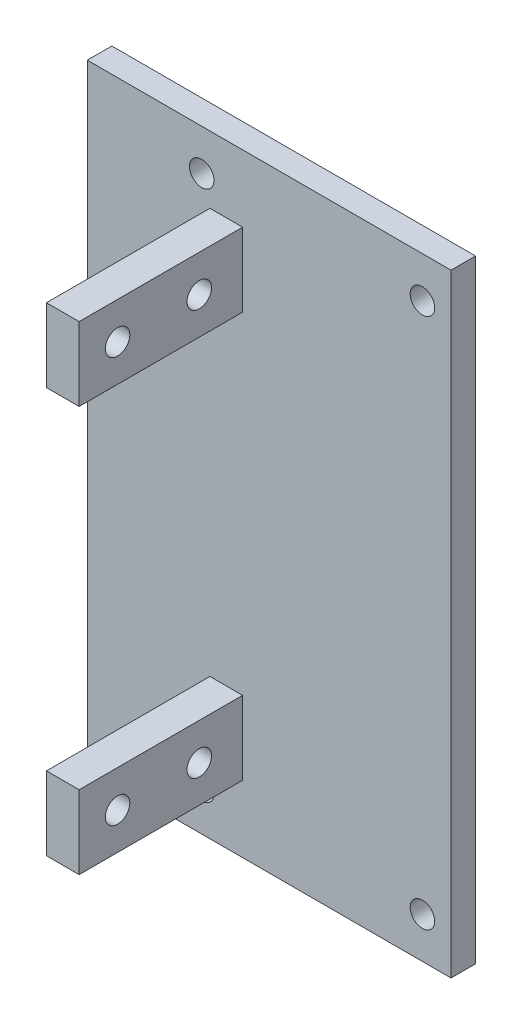
ISO-10303-21;
HEADER;
FILE_DESCRIPTION(('STEP AP214'),'2;1');
FILE_NAME('part.step','',(''),(''),'','','');
FILE_SCHEMA(('AUTOMOTIVE_DESIGN { 1 0 10303 214 1 1 1 1 }'));
ENDSEC;
DATA;
#1=APPLICATION_CONTEXT('core data for automotive mechanical design processes');
#2=APPLICATION_PROTOCOL_DEFINITION('international standard','automotive_design',2000,#1);
#3=PRODUCT_CONTEXT('',#1,'mechanical');
#4=PRODUCT('Part','Part','',(#3));
#5=PRODUCT_RELATED_PRODUCT_CATEGORY('part','',(#4));
#6=PRODUCT_DEFINITION_FORMATION('','',#4);
#7=PRODUCT_DEFINITION_CONTEXT('part definition',#1,'design');
#8=PRODUCT_DEFINITION('design','',#6,#7);
#9=PRODUCT_DEFINITION_SHAPE('','',#8);
#10=(LENGTH_UNIT() NAMED_UNIT(*) SI_UNIT(.MILLI.,.METRE.));
#11=(NAMED_UNIT(*) PLANE_ANGLE_UNIT() SI_UNIT($,.RADIAN.));
#12=(NAMED_UNIT(*) SI_UNIT($,.STERADIAN.) SOLID_ANGLE_UNIT());
#13=UNCERTAINTY_MEASURE_WITH_UNIT(LENGTH_MEASURE(1.E-05),#10,'distance_accuracy_value','');
#14=(GEOMETRIC_REPRESENTATION_CONTEXT(3) GLOBAL_UNCERTAINTY_ASSIGNED_CONTEXT((#13)) GLOBAL_UNIT_ASSIGNED_CONTEXT((#10,
#11,#12)) REPRESENTATION_CONTEXT('',''));
#15=CARTESIAN_POINT('',(0.,0.,0.));
#16=DIRECTION('',(0.,0.,1.));
#17=DIRECTION('',(1.,0.,0.));
#18=AXIS2_PLACEMENT_3D('',#15,#16,#17);
#19=CARTESIAN_POINT('',(0.,0.,3.));
#20=DIRECTION('',(0.,0.,-1.));
#21=DIRECTION('',(-1.,0.,0.));
#22=AXIS2_PLACEMENT_3D('',#19,#20,#21);
#23=PLANE('',#22);
#24=DIRECTION('',(-1.,0.,0.));
#25=VECTOR('',#24,1.);
#26=CARTESIAN_POINT('',(-10.,-29.3,3.));
#27=LINE('',#26,#25);
#28=CARTESIAN_POINT('',(-6.,-29.3,3.));
#29=VERTEX_POINT('',#28);
#30=CARTESIAN_POINT('',(-10.,-29.3,3.));
#31=VERTEX_POINT('',#30);
#32=EDGE_CURVE('E230',#29,#31,#27,.T.);
#33=ORIENTED_EDGE('',*,*,#32,.T.);
#34=DIRECTION('',(0.,1.,0.));
#35=VECTOR('',#34,1.);
#36=CARTESIAN_POINT('',(-10.,-29.3,3.));
#37=LINE('',#36,#35);
#38=CARTESIAN_POINT('',(-10.,-20.3,3.));
#39=VERTEX_POINT('',#38);
#40=EDGE_CURVE('E201',#31,#39,#37,.T.);
#41=ORIENTED_EDGE('',*,*,#40,.T.);
#42=DIRECTION('',(1.,0.,0.));
#43=VECTOR('',#42,1.);
#44=CARTESIAN_POINT('',(-10.,-20.3,3.));
#45=LINE('',#44,#43);
#46=CARTESIAN_POINT('',(-6.,-20.3,3.));
#47=VERTEX_POINT('',#46);
#48=EDGE_CURVE('E214',#39,#47,#45,.T.);
#49=ORIENTED_EDGE('',*,*,#48,.T.);
#50=DIRECTION('',(0.,-1.,0.));
#51=VECTOR('',#50,1.);
#52=CARTESIAN_POINT('',(-6.,-29.3,3.));
#53=LINE('',#52,#51);
#54=EDGE_CURVE('E65',#47,#29,#53,.T.);
#55=ORIENTED_EDGE('',*,*,#54,.T.);
#56=EDGE_LOOP('',(#33,#41,#49,#55));
#57=FACE_BOUND('',#56,.T.);
#58=CARTESIAN_POINT('',(-11.,-32.5,3.));
#59=DIRECTION('',(0.,0.,1.));
#60=DIRECTION('',(1.,0.,0.));
#61=AXIS2_PLACEMENT_3D('',#58,#59,#60);
#62=CIRCLE('',#61,1.5);
#63=CARTESIAN_POINT('',(-9.49999999999998,-32.5,3.));
#64=VERTEX_POINT('',#63);
#65=EDGE_CURVE('E301',#64,#64,#62,.T.);
#66=ORIENTED_EDGE('',*,*,#65,.F.);
#67=EDGE_LOOP('',(#66));
#68=FACE_BOUND('',#67,.T.);
#69=CARTESIAN_POINT('',(16.,-32.5,3.));
#70=DIRECTION('',(0.,0.,1.));
#71=DIRECTION('',(1.,0.,0.));
#72=AXIS2_PLACEMENT_3D('',#69,#70,#71);
#73=CIRCLE('',#72,1.5);
#74=CARTESIAN_POINT('',(17.5,-32.5,3.));
#75=VERTEX_POINT('',#74);
#76=EDGE_CURVE('E309',#75,#75,#73,.T.);
#77=ORIENTED_EDGE('',*,*,#76,.F.);
#78=EDGE_LOOP('',(#77));
#79=FACE_BOUND('',#78,.T.);
#80=CARTESIAN_POINT('',(16.,32.5,3.));
#81=DIRECTION('',(0.,0.,1.));
#82=DIRECTION('',(1.,0.,0.));
#83=AXIS2_PLACEMENT_3D('',#80,#81,#82);
#84=CIRCLE('',#83,1.5);
#85=CARTESIAN_POINT('',(17.5,32.5,3.));
#86=VERTEX_POINT('',#85);
#87=EDGE_CURVE('E317',#86,#86,#84,.T.);
#88=ORIENTED_EDGE('',*,*,#87,.F.);
#89=EDGE_LOOP('',(#88));
#90=FACE_BOUND('',#89,.T.);
#91=CARTESIAN_POINT('',(-11.,32.5,3.));
#92=DIRECTION('',(0.,0.,1.));
#93=DIRECTION('',(1.,0.,0.));
#94=AXIS2_PLACEMENT_3D('',#91,#92,#93);
#95=CIRCLE('',#94,1.5);
#96=CARTESIAN_POINT('',(-9.49999999999998,32.5,3.));
#97=VERTEX_POINT('',#96);
#98=EDGE_CURVE('E169',#97,#97,#95,.T.);
#99=ORIENTED_EDGE('',*,*,#98,.F.);
#100=EDGE_LOOP('',(#99));
#101=FACE_BOUND('',#100,.T.);
#102=DIRECTION('',(1.,0.,0.));
#103=VECTOR('',#102,1.);
#104=CARTESIAN_POINT('',(-25.,-37.5,3.));
#105=LINE('',#104,#103);
#106=CARTESIAN_POINT('',(-25.,-37.5,3.));
#107=VERTEX_POINT('',#106);
#108=CARTESIAN_POINT('',(19.5,-37.5,3.));
#109=VERTEX_POINT('',#108);
#110=EDGE_CURVE('E144',#107,#109,#105,.T.);
#111=ORIENTED_EDGE('',*,*,#110,.T.);
#112=DIRECTION('',(0.,-1.,0.));
#113=VECTOR('',#112,1.);
#114=CARTESIAN_POINT('',(19.5,37.5,3.));
#115=LINE('',#114,#113);
#116=CARTESIAN_POINT('',(19.5,37.5,3.));
#117=VERTEX_POINT('',#116);
#118=EDGE_CURVE('E58',#117,#109,#115,.T.);
#119=ORIENTED_EDGE('',*,*,#118,.F.);
#120=DIRECTION('',(-1.,0.,0.));
#121=VECTOR('',#120,1.);
#122=CARTESIAN_POINT('',(-25.,37.5,3.));
#123=LINE('',#122,#121);
#124=CARTESIAN_POINT('',(-25.,37.5,3.));
#125=VERTEX_POINT('',#124);
#126=EDGE_CURVE('E141',#117,#125,#123,.T.);
#127=ORIENTED_EDGE('',*,*,#126,.T.);
#128=DIRECTION('',(0.,-1.,0.));
#129=VECTOR('',#128,1.);
#130=CARTESIAN_POINT('',(-25.,-37.5,3.));
#131=LINE('',#130,#129);
#132=EDGE_CURVE('E150',#125,#107,#131,.T.);
#133=ORIENTED_EDGE('',*,*,#132,.T.);
#134=EDGE_LOOP('',(#111,#119,#127,#133));
#135=FACE_BOUND('',#134,.T.);
#136=DIRECTION('',(0.,-1.,0.));
#137=VECTOR('',#136,1.);
#138=CARTESIAN_POINT('',(-10.,29.3,3.));
#139=LINE('',#138,#137);
#140=CARTESIAN_POINT('',(-10.,29.3,3.));
#141=VERTEX_POINT('',#140);
#142=CARTESIAN_POINT('',(-10.,20.3,3.));
#143=VERTEX_POINT('',#142);
#144=EDGE_CURVE('E255',#141,#143,#139,.T.);
#145=ORIENTED_EDGE('',*,*,#144,.F.);
#146=DIRECTION('',(-1.,0.,0.));
#147=VECTOR('',#146,1.);
#148=CARTESIAN_POINT('',(-10.,29.3,3.));
#149=LINE('',#148,#147);
#150=CARTESIAN_POINT('',(-6.,29.3,3.));
#151=VERTEX_POINT('',#150);
#152=EDGE_CURVE('E261',#151,#141,#149,.T.);
#153=ORIENTED_EDGE('',*,*,#152,.F.);
#154=DIRECTION('',(0.,1.,0.));
#155=VECTOR('',#154,1.);
#156=CARTESIAN_POINT('',(-6.,29.3,3.));
#157=LINE('',#156,#155);
#158=CARTESIAN_POINT('',(-6.,20.3,3.));
#159=VERTEX_POINT('',#158);
#160=EDGE_CURVE('E278',#159,#151,#157,.T.);
#161=ORIENTED_EDGE('',*,*,#160,.F.);
#162=DIRECTION('',(1.,0.,0.));
#163=VECTOR('',#162,1.);
#164=CARTESIAN_POINT('',(-10.,20.3,3.));
#165=LINE('',#164,#163);
#166=EDGE_CURVE('E274',#143,#159,#165,.T.);
#167=ORIENTED_EDGE('',*,*,#166,.F.);
#168=EDGE_LOOP('',(#145,#153,#161,#167));
#169=FACE_BOUND('',#168,.T.);
#170=ADVANCED_FACE('F42',(#57,#68,#79,#90,#101,#135,#169),#23,.F.);
#171=CARTESIAN_POINT('',(0.,0.,0.));
#172=DIRECTION('',(0.,0.,-1.));
#173=DIRECTION('',(-1.,0.,0.));
#174=AXIS2_PLACEMENT_3D('',#171,#172,#173);
#175=PLANE('',#174);
#176=DIRECTION('',(0.,1.,0.));
#177=VECTOR('',#176,1.);
#178=CARTESIAN_POINT('',(19.5,0.,0.));
#179=LINE('',#178,#177);
#180=CARTESIAN_POINT('',(19.5,-37.5,0.));
#181=VERTEX_POINT('',#180);
#182=CARTESIAN_POINT('',(19.5,37.5,0.));
#183=VERTEX_POINT('',#182);
#184=EDGE_CURVE('E132',#181,#183,#179,.T.);
#185=ORIENTED_EDGE('',*,*,#184,.F.);
#186=DIRECTION('',(1.,0.,0.));
#187=VECTOR('',#186,1.);
#188=CARTESIAN_POINT('',(-25.,-37.5,0.));
#189=LINE('',#188,#187);
#190=CARTESIAN_POINT('',(-25.,-37.5,0.));
#191=VERTEX_POINT('',#190);
#192=EDGE_CURVE('E151',#191,#181,#189,.T.);
#193=ORIENTED_EDGE('',*,*,#192,.F.);
#194=DIRECTION('',(0.,-1.,0.));
#195=VECTOR('',#194,1.);
#196=CARTESIAN_POINT('',(-25.,-37.5,0.));
#197=LINE('',#196,#195);
#198=CARTESIAN_POINT('',(-25.,37.5,0.));
#199=VERTEX_POINT('',#198);
#200=EDGE_CURVE('E157',#199,#191,#197,.T.);
#201=ORIENTED_EDGE('',*,*,#200,.F.);
#202=DIRECTION('',(-1.,0.,0.));
#203=VECTOR('',#202,1.);
#204=CARTESIAN_POINT('',(-25.,37.5,0.));
#205=LINE('',#204,#203);
#206=EDGE_CURVE('E166',#183,#199,#205,.T.);
#207=ORIENTED_EDGE('',*,*,#206,.F.);
#208=EDGE_LOOP('',(#185,#193,#201,#207));
#209=FACE_BOUND('',#208,.T.);
#210=CARTESIAN_POINT('',(16.,-32.5,0.));
#211=DIRECTION('',(0.,0.,1.));
#212=DIRECTION('',(1.,0.,0.));
#213=AXIS2_PLACEMENT_3D('',#210,#211,#212);
#214=CIRCLE('',#213,1.5);
#215=CARTESIAN_POINT('',(17.5,-32.5,0.));
#216=VERTEX_POINT('',#215);
#217=EDGE_CURVE('E305',#216,#216,#214,.T.);
#218=ORIENTED_EDGE('',*,*,#217,.T.);
#219=EDGE_LOOP('',(#218));
#220=FACE_BOUND('',#219,.T.);
#221=CARTESIAN_POINT('',(-11.,32.5,0.));
#222=DIRECTION('',(0.,0.,1.));
#223=DIRECTION('',(1.,0.,0.));
#224=AXIS2_PLACEMENT_3D('',#221,#222,#223);
#225=CIRCLE('',#224,1.5);
#226=CARTESIAN_POINT('',(-9.49999999999998,32.5,0.));
#227=VERTEX_POINT('',#226);
#228=EDGE_CURVE('E160',#227,#227,#225,.T.);
#229=ORIENTED_EDGE('',*,*,#228,.T.);
#230=EDGE_LOOP('',(#229));
#231=FACE_BOUND('',#230,.T.);
#232=CARTESIAN_POINT('',(16.,32.5,0.));
#233=DIRECTION('',(0.,0.,1.));
#234=DIRECTION('',(1.,0.,0.));
#235=AXIS2_PLACEMENT_3D('',#232,#233,#234);
#236=CIRCLE('',#235,1.5);
#237=CARTESIAN_POINT('',(17.5,32.5,0.));
#238=VERTEX_POINT('',#237);
#239=EDGE_CURVE('E313',#238,#238,#236,.T.);
#240=ORIENTED_EDGE('',*,*,#239,.T.);
#241=EDGE_LOOP('',(#240));
#242=FACE_BOUND('',#241,.T.);
#243=CARTESIAN_POINT('',(-11.,-32.5,0.));
#244=DIRECTION('',(0.,0.,1.));
#245=DIRECTION('',(1.,0.,0.));
#246=AXIS2_PLACEMENT_3D('',#243,#244,#245);
#247=CIRCLE('',#246,1.5);
#248=CARTESIAN_POINT('',(-9.49999999999998,-32.5,0.));
#249=VERTEX_POINT('',#248);
#250=EDGE_CURVE('E300',#249,#249,#247,.T.);
#251=ORIENTED_EDGE('',*,*,#250,.T.);
#252=EDGE_LOOP('',(#251));
#253=FACE_BOUND('',#252,.T.);
#254=ADVANCED_FACE('F331',(#209,#220,#231,#242,#253),#175,.T.);
#255=CARTESIAN_POINT('',(-25.,37.5,3.));
#256=DIRECTION('',(0.,-1.,0.));
#257=DIRECTION('',(1.,0.,0.));
#258=AXIS2_PLACEMENT_3D('',#255,#256,#257);
#259=PLANE('',#258);
#260=ORIENTED_EDGE('',*,*,#126,.F.);
#261=DIRECTION('',(0.,0.,1.));
#262=VECTOR('',#261,1.);
#263=CARTESIAN_POINT('',(19.5,37.5,-7.));
#264=LINE('',#263,#262);
#265=EDGE_CURVE('E129',#183,#117,#264,.T.);
#266=ORIENTED_EDGE('',*,*,#265,.F.);
#267=ORIENTED_EDGE('',*,*,#206,.T.);
#268=DIRECTION('',(0.,0.,-1.));
#269=VECTOR('',#268,1.);
#270=CARTESIAN_POINT('',(-25.,37.5,3.));
#271=LINE('',#270,#269);
#272=EDGE_CURVE('E51',#125,#199,#271,.T.);
#273=ORIENTED_EDGE('',*,*,#272,.F.);
#274=EDGE_LOOP('',(#260,#266,#267,#273));
#275=FACE_BOUND('',#274,.T.);
#276=ADVANCED_FACE('F44',(#275),#259,.F.);
#277=CARTESIAN_POINT('',(-25.,-37.5,3.));
#278=DIRECTION('',(1.,0.,0.));
#279=DIRECTION('',(0.,1.,0.));
#280=AXIS2_PLACEMENT_3D('',#277,#278,#279);
#281=PLANE('',#280);
#282=ORIENTED_EDGE('',*,*,#200,.T.);
#283=DIRECTION('',(0.,0.,-1.));
#284=VECTOR('',#283,1.);
#285=CARTESIAN_POINT('',(-25.,-37.5,3.));
#286=LINE('',#285,#284);
#287=EDGE_CURVE('E165',#107,#191,#286,.T.);
#288=ORIENTED_EDGE('',*,*,#287,.F.);
#289=ORIENTED_EDGE('',*,*,#132,.F.);
#290=ORIENTED_EDGE('',*,*,#272,.T.);
#291=EDGE_LOOP('',(#282,#288,#289,#290));
#292=FACE_BOUND('',#291,.T.);
#293=ADVANCED_FACE('F347',(#292),#281,.F.);
#294=CARTESIAN_POINT('',(-25.,-37.5,3.));
#295=DIRECTION('',(0.,1.,0.));
#296=DIRECTION('',(0.,0.,1.));
#297=AXIS2_PLACEMENT_3D('',#294,#295,#296);
#298=PLANE('',#297);
#299=ORIENTED_EDGE('',*,*,#192,.T.);
#300=DIRECTION('',(0.,0.,1.));
#301=VECTOR('',#300,1.);
#302=CARTESIAN_POINT('',(19.5,-37.5,3.));
#303=LINE('',#302,#301);
#304=EDGE_CURVE('E11',#181,#109,#303,.T.);
#305=ORIENTED_EDGE('',*,*,#304,.T.);
#306=ORIENTED_EDGE('',*,*,#110,.F.);
#307=ORIENTED_EDGE('',*,*,#287,.T.);
#308=EDGE_LOOP('',(#299,#305,#306,#307));
#309=FACE_BOUND('',#308,.T.);
#310=ADVANCED_FACE('F337',(#309),#298,.F.);
#311=CARTESIAN_POINT('',(-11.,32.5,3.));
#312=DIRECTION('',(0.,0.,-1.));
#313=DIRECTION('',(-1.,0.,0.));
#314=AXIS2_PLACEMENT_3D('',#311,#312,#313);
#315=CYLINDRICAL_SURFACE('',#314,1.5);
#316=ORIENTED_EDGE('',*,*,#98,.T.);
#317=EDGE_LOOP('',(#316));
#318=FACE_BOUND('',#317,.T.);
#319=ORIENTED_EDGE('',*,*,#228,.F.);
#320=EDGE_LOOP('',(#319));
#321=FACE_BOUND('',#320,.T.);
#322=ADVANCED_FACE('F334',(#318,#321),#315,.F.);
#323=CARTESIAN_POINT('',(16.,32.5,3.));
#324=DIRECTION('',(0.,0.,-1.));
#325=DIRECTION('',(-1.,0.,0.));
#326=AXIS2_PLACEMENT_3D('',#323,#324,#325);
#327=CYLINDRICAL_SURFACE('',#326,1.5);
#328=ORIENTED_EDGE('',*,*,#87,.T.);
#329=EDGE_LOOP('',(#328));
#330=FACE_BOUND('',#329,.T.);
#331=ORIENTED_EDGE('',*,*,#239,.F.);
#332=EDGE_LOOP('',(#331));
#333=FACE_BOUND('',#332,.T.);
#334=ADVANCED_FACE('F336',(#330,#333),#327,.F.);
#335=CARTESIAN_POINT('',(16.,-32.5,3.));
#336=DIRECTION('',(0.,0.,-1.));
#337=DIRECTION('',(-1.,0.,0.));
#338=AXIS2_PLACEMENT_3D('',#335,#336,#337);
#339=CYLINDRICAL_SURFACE('',#338,1.5);
#340=ORIENTED_EDGE('',*,*,#76,.T.);
#341=EDGE_LOOP('',(#340));
#342=FACE_BOUND('',#341,.T.);
#343=ORIENTED_EDGE('',*,*,#217,.F.);
#344=EDGE_LOOP('',(#343));
#345=FACE_BOUND('',#344,.T.);
#346=ADVANCED_FACE('F343',(#342,#345),#339,.F.);
#347=CARTESIAN_POINT('',(-11.,-32.5,3.));
#348=DIRECTION('',(0.,0.,-1.));
#349=DIRECTION('',(-1.,0.,0.));
#350=AXIS2_PLACEMENT_3D('',#347,#348,#349);
#351=CYLINDRICAL_SURFACE('',#350,1.5);
#352=ORIENTED_EDGE('',*,*,#65,.T.);
#353=EDGE_LOOP('',(#352));
#354=FACE_BOUND('',#353,.T.);
#355=ORIENTED_EDGE('',*,*,#250,.F.);
#356=EDGE_LOOP('',(#355));
#357=FACE_BOUND('',#356,.T.);
#358=ADVANCED_FACE('F374',(#354,#357),#351,.F.);
#359=CARTESIAN_POINT('',(-10.,29.3,23.));
#360=DIRECTION('',(1.,0.,0.));
#361=DIRECTION('',(0.,0.,-1.));
#362=AXIS2_PLACEMENT_3D('',#359,#360,#361);
#363=PLANE('',#362);
#364=CARTESIAN_POINT('',(-10.,24.8,18.3));
#365=DIRECTION('',(1.,0.,0.));
#366=DIRECTION('',(0.,0.,-1.));
#367=AXIS2_PLACEMENT_3D('',#364,#365,#366);
#368=CIRCLE('',#367,1.5);
#369=CARTESIAN_POINT('',(-10.,24.8,16.8));
#370=VERTEX_POINT('',#369);
#371=EDGE_CURVE('E187',#370,#370,#368,.T.);
#372=ORIENTED_EDGE('',*,*,#371,.T.);
#373=EDGE_LOOP('',(#372));
#374=FACE_BOUND('',#373,.T.);
#375=CARTESIAN_POINT('',(-10.,24.8,8.3));
#376=DIRECTION('',(1.,0.,0.));
#377=DIRECTION('',(0.,0.,-1.));
#378=AXIS2_PLACEMENT_3D('',#375,#376,#377);
#379=CIRCLE('',#378,1.5);
#380=CARTESIAN_POINT('',(-10.,24.8,6.8));
#381=VERTEX_POINT('',#380);
#382=EDGE_CURVE('E181',#381,#381,#379,.T.);
#383=ORIENTED_EDGE('',*,*,#382,.T.);
#384=EDGE_LOOP('',(#383));
#385=FACE_BOUND('',#384,.T.);
#386=ORIENTED_EDGE('',*,*,#144,.T.);
#387=DIRECTION('',(0.,0.,-1.));
#388=VECTOR('',#387,1.);
#389=CARTESIAN_POINT('',(-10.,20.3,23.));
#390=LINE('',#389,#388);
#391=CARTESIAN_POINT('',(-10.,20.3,23.));
#392=VERTEX_POINT('',#391);
#393=EDGE_CURVE('E296',#392,#143,#390,.T.);
#394=ORIENTED_EDGE('',*,*,#393,.F.);
#395=DIRECTION('',(0.,-1.,0.));
#396=VECTOR('',#395,1.);
#397=CARTESIAN_POINT('',(-10.,29.3,23.));
#398=LINE('',#397,#396);
#399=CARTESIAN_POINT('',(-10.,29.3,23.));
#400=VERTEX_POINT('',#399);
#401=EDGE_CURVE('E256',#400,#392,#398,.T.);
#402=ORIENTED_EDGE('',*,*,#401,.F.);
#403=DIRECTION('',(0.,0.,-1.));
#404=VECTOR('',#403,1.);
#405=CARTESIAN_POINT('',(-10.,29.3,23.));
#406=LINE('',#405,#404);
#407=EDGE_CURVE('E270',#400,#141,#406,.T.);
#408=ORIENTED_EDGE('',*,*,#407,.T.);
#409=EDGE_LOOP('',(#386,#394,#402,#408));
#410=FACE_BOUND('',#409,.T.);
#411=ADVANCED_FACE('F380',(#374,#385,#410),#363,.F.);
#412=CARTESIAN_POINT('',(-10.,20.3,23.));
#413=DIRECTION('',(0.,1.,0.));
#414=DIRECTION('',(-1.,0.,0.));
#415=AXIS2_PLACEMENT_3D('',#412,#413,#414);
#416=PLANE('',#415);
#417=ORIENTED_EDGE('',*,*,#166,.T.);
#418=DIRECTION('',(0.,0.,-1.));
#419=VECTOR('',#418,1.);
#420=CARTESIAN_POINT('',(-6.,20.3,23.));
#421=LINE('',#420,#419);
#422=CARTESIAN_POINT('',(-6.,20.3,23.));
#423=VERTEX_POINT('',#422);
#424=EDGE_CURVE('E292',#423,#159,#421,.T.);
#425=ORIENTED_EDGE('',*,*,#424,.F.);
#426=DIRECTION('',(1.,0.,0.));
#427=VECTOR('',#426,1.);
#428=CARTESIAN_POINT('',(-10.,20.3,23.));
#429=LINE('',#428,#427);
#430=EDGE_CURVE('E260',#392,#423,#429,.T.);
#431=ORIENTED_EDGE('',*,*,#430,.F.);
#432=ORIENTED_EDGE('',*,*,#393,.T.);
#433=EDGE_LOOP('',(#417,#425,#431,#432));
#434=FACE_BOUND('',#433,.T.);
#435=ADVANCED_FACE('F386',(#434),#416,.F.);
#436=CARTESIAN_POINT('',(-6.,29.3,23.));
#437=DIRECTION('',(-1.,0.,0.));
#438=DIRECTION('',(0.,0.,1.));
#439=AXIS2_PLACEMENT_3D('',#436,#437,#438);
#440=PLANE('',#439);
#441=CARTESIAN_POINT('',(-6.,24.8,18.3));
#442=DIRECTION('',(-1.,0.,0.));
#443=DIRECTION('',(0.,0.,1.));
#444=AXIS2_PLACEMENT_3D('',#441,#442,#443);
#445=CIRCLE('',#444,1.5);
#446=CARTESIAN_POINT('',(-6.,24.8,19.8));
#447=VERTEX_POINT('',#446);
#448=EDGE_CURVE('E183',#447,#447,#445,.T.);
#449=ORIENTED_EDGE('',*,*,#448,.T.);
#450=EDGE_LOOP('',(#449));
#451=FACE_BOUND('',#450,.T.);
#452=CARTESIAN_POINT('',(-6.,24.8,8.3));
#453=DIRECTION('',(-1.,0.,0.));
#454=DIRECTION('',(0.,0.,1.));
#455=AXIS2_PLACEMENT_3D('',#452,#453,#454);
#456=CIRCLE('',#455,1.5);
#457=CARTESIAN_POINT('',(-6.,24.8,9.8));
#458=VERTEX_POINT('',#457);
#459=EDGE_CURVE('E177',#458,#458,#456,.T.);
#460=ORIENTED_EDGE('',*,*,#459,.T.);
#461=EDGE_LOOP('',(#460));
#462=FACE_BOUND('',#461,.T.);
#463=ORIENTED_EDGE('',*,*,#160,.T.);
#464=DIRECTION('',(0.,0.,-1.));
#465=VECTOR('',#464,1.);
#466=CARTESIAN_POINT('',(-6.,29.3,23.));
#467=LINE('',#466,#465);
#468=CARTESIAN_POINT('',(-6.,29.3,23.));
#469=VERTEX_POINT('',#468);
#470=EDGE_CURVE('E288',#469,#151,#467,.T.);
#471=ORIENTED_EDGE('',*,*,#470,.F.);
#472=DIRECTION('',(0.,1.,0.));
#473=VECTOR('',#472,1.);
#474=CARTESIAN_POINT('',(-6.,29.3,23.));
#475=LINE('',#474,#473);
#476=EDGE_CURVE('E264',#423,#469,#475,.T.);
#477=ORIENTED_EDGE('',*,*,#476,.F.);
#478=ORIENTED_EDGE('',*,*,#424,.T.);
#479=EDGE_LOOP('',(#463,#471,#477,#478));
#480=FACE_BOUND('',#479,.T.);
#481=ADVANCED_FACE('F390',(#451,#462,#480),#440,.F.);
#482=CARTESIAN_POINT('',(-10.,29.3,23.));
#483=DIRECTION('',(0.,-1.,0.));
#484=DIRECTION('',(0.,0.,-1.));
#485=AXIS2_PLACEMENT_3D('',#482,#483,#484);
#486=PLANE('',#485);
#487=ORIENTED_EDGE('',*,*,#152,.T.);
#488=ORIENTED_EDGE('',*,*,#407,.F.);
#489=DIRECTION('',(-1.,0.,0.));
#490=VECTOR('',#489,1.);
#491=CARTESIAN_POINT('',(-10.,29.3,23.));
#492=LINE('',#491,#490);
#493=EDGE_CURVE('E267',#469,#400,#492,.T.);
#494=ORIENTED_EDGE('',*,*,#493,.F.);
#495=ORIENTED_EDGE('',*,*,#470,.T.);
#496=EDGE_LOOP('',(#487,#488,#494,#495));
#497=FACE_BOUND('',#496,.T.);
#498=ADVANCED_FACE('F394',(#497),#486,.F.);
#499=CARTESIAN_POINT('',(0.,0.,23.));
#500=DIRECTION('',(0.,0.,1.));
#501=DIRECTION('',(1.,0.,0.));
#502=AXIS2_PLACEMENT_3D('',#499,#500,#501);
#503=PLANE('',#502);
#504=ORIENTED_EDGE('',*,*,#401,.T.);
#505=ORIENTED_EDGE('',*,*,#430,.T.);
#506=ORIENTED_EDGE('',*,*,#476,.T.);
#507=ORIENTED_EDGE('',*,*,#493,.T.);
#508=EDGE_LOOP('',(#504,#505,#506,#507));
#509=FACE_BOUND('',#508,.T.);
#510=ADVANCED_FACE('F398',(#509),#503,.T.);
#511=CARTESIAN_POINT('',(25.,24.8,8.3));
#512=DIRECTION('',(-1.,0.,0.));
#513=DIRECTION('',(0.,-1.,0.));
#514=AXIS2_PLACEMENT_3D('',#511,#512,#513);
#515=CYLINDRICAL_SURFACE('',#514,1.5);
#516=ORIENTED_EDGE('',*,*,#459,.F.);
#517=EDGE_LOOP('',(#516));
#518=FACE_BOUND('',#517,.T.);
#519=ORIENTED_EDGE('',*,*,#382,.F.);
#520=EDGE_LOOP('',(#519));
#521=FACE_BOUND('',#520,.T.);
#522=ADVANCED_FACE('F402',(#518,#521),#515,.F.);
#523=CARTESIAN_POINT('',(25.,24.8,18.3));
#524=DIRECTION('',(-1.,0.,0.));
#525=DIRECTION('',(0.,-1.,0.));
#526=AXIS2_PLACEMENT_3D('',#523,#524,#525);
#527=CYLINDRICAL_SURFACE('',#526,1.5);
#528=ORIENTED_EDGE('',*,*,#448,.F.);
#529=EDGE_LOOP('',(#528));
#530=FACE_BOUND('',#529,.T.);
#531=ORIENTED_EDGE('',*,*,#371,.F.);
#532=EDGE_LOOP('',(#531));
#533=FACE_BOUND('',#532,.T.);
#534=ADVANCED_FACE('F406',(#530,#533),#527,.F.);
#535=CARTESIAN_POINT('',(-10.,-29.3,23.));
#536=DIRECTION('',(-1.,0.,0.));
#537=DIRECTION('',(0.,0.,1.));
#538=AXIS2_PLACEMENT_3D('',#535,#536,#537);
#539=PLANE('',#538);
#540=CARTESIAN_POINT('',(-10.,-24.8,18.3));
#541=DIRECTION('',(-1.,0.,0.));
#542=DIRECTION('',(0.,0.,1.));
#543=AXIS2_PLACEMENT_3D('',#540,#541,#542);
#544=CIRCLE('',#543,1.5);
#545=CARTESIAN_POINT('',(-10.,-24.8,19.8));
#546=VERTEX_POINT('',#545);
#547=EDGE_CURVE('E195',#546,#546,#544,.F.);
#548=ORIENTED_EDGE('',*,*,#547,.T.);
#549=EDGE_LOOP('',(#548));
#550=FACE_BOUND('',#549,.T.);
#551=CARTESIAN_POINT('',(-10.,-24.8,8.3));
#552=DIRECTION('',(-1.,0.,0.));
#553=DIRECTION('',(0.,0.,1.));
#554=AXIS2_PLACEMENT_3D('',#551,#552,#553);
#555=CIRCLE('',#554,1.5);
#556=CARTESIAN_POINT('',(-10.,-24.8,9.8));
#557=VERTEX_POINT('',#556);
#558=EDGE_CURVE('E191',#557,#557,#555,.F.);
#559=ORIENTED_EDGE('',*,*,#558,.T.);
#560=EDGE_LOOP('',(#559));
#561=FACE_BOUND('',#560,.T.);
#562=ORIENTED_EDGE('',*,*,#40,.F.);
#563=DIRECTION('',(0.,0.,-1.));
#564=VECTOR('',#563,1.);
#565=CARTESIAN_POINT('',(-10.,-29.3,23.));
#566=LINE('',#565,#564);
#567=CARTESIAN_POINT('',(-10.,-29.3,23.));
#568=VERTEX_POINT('',#567);
#569=EDGE_CURVE('E182',#568,#31,#566,.T.);
#570=ORIENTED_EDGE('',*,*,#569,.F.);
#571=DIRECTION('',(0.,1.,0.));
#572=VECTOR('',#571,1.);
#573=CARTESIAN_POINT('',(-10.,-29.3,23.));
#574=LINE('',#573,#572);
#575=CARTESIAN_POINT('',(-10.,-20.3,23.));
#576=VERTEX_POINT('',#575);
#577=EDGE_CURVE('E209',#568,#576,#574,.T.);
#578=ORIENTED_EDGE('',*,*,#577,.T.);
#579=DIRECTION('',(0.,0.,-1.));
#580=VECTOR('',#579,1.);
#581=CARTESIAN_POINT('',(-10.,-20.3,23.));
#582=LINE('',#581,#580);
#583=EDGE_CURVE('E226',#576,#39,#582,.T.);
#584=ORIENTED_EDGE('',*,*,#583,.T.);
#585=EDGE_LOOP('',(#562,#570,#578,#584));
#586=FACE_BOUND('',#585,.T.);
#587=ADVANCED_FACE('F410',(#550,#561,#586),#539,.T.);
#588=CARTESIAN_POINT('',(-10.,-29.3,23.));
#589=DIRECTION('',(0.,-1.,0.));
#590=DIRECTION('',(0.,0.,-1.));
#591=AXIS2_PLACEMENT_3D('',#588,#589,#590);
#592=PLANE('',#591);
#593=ORIENTED_EDGE('',*,*,#32,.F.);
#594=DIRECTION('',(0.,0.,-1.));
#595=VECTOR('',#594,1.);
#596=CARTESIAN_POINT('',(-6.,-29.3,23.));
#597=LINE('',#596,#595);
#598=CARTESIAN_POINT('',(-6.,-29.3,23.));
#599=VERTEX_POINT('',#598);
#600=EDGE_CURVE('E244',#599,#29,#597,.T.);
#601=ORIENTED_EDGE('',*,*,#600,.F.);
#602=DIRECTION('',(-1.,0.,0.));
#603=VECTOR('',#602,1.);
#604=CARTESIAN_POINT('',(-10.,-29.3,23.));
#605=LINE('',#604,#603);
#606=EDGE_CURVE('E213',#599,#568,#605,.T.);
#607=ORIENTED_EDGE('',*,*,#606,.T.);
#608=ORIENTED_EDGE('',*,*,#569,.T.);
#609=EDGE_LOOP('',(#593,#601,#607,#608));
#610=FACE_BOUND('',#609,.T.);
#611=ADVANCED_FACE('F414',(#610),#592,.T.);
#612=CARTESIAN_POINT('',(-6.,-29.3,23.));
#613=DIRECTION('',(1.,0.,0.));
#614=DIRECTION('',(0.,0.,-1.));
#615=AXIS2_PLACEMENT_3D('',#612,#613,#614);
#616=PLANE('',#615);
#617=CARTESIAN_POINT('',(-6.,-24.8,18.3));
#618=DIRECTION('',(1.,0.,0.));
#619=DIRECTION('',(0.,0.,-1.));
#620=AXIS2_PLACEMENT_3D('',#617,#618,#619);
#621=CIRCLE('',#620,1.5);
#622=CARTESIAN_POINT('',(-6.,-24.8,16.8));
#623=VERTEX_POINT('',#622);
#624=EDGE_CURVE('E192',#623,#623,#621,.F.);
#625=ORIENTED_EDGE('',*,*,#624,.T.);
#626=EDGE_LOOP('',(#625));
#627=FACE_BOUND('',#626,.T.);
#628=CARTESIAN_POINT('',(-6.,-24.8,8.3));
#629=DIRECTION('',(1.,0.,0.));
#630=DIRECTION('',(0.,0.,-1.));
#631=AXIS2_PLACEMENT_3D('',#628,#629,#630);
#632=CIRCLE('',#631,1.5);
#633=CARTESIAN_POINT('',(-6.,-24.8,6.8));
#634=VERTEX_POINT('',#633);
#635=EDGE_CURVE('E188',#634,#634,#632,.F.);
#636=ORIENTED_EDGE('',*,*,#635,.T.);
#637=EDGE_LOOP('',(#636));
#638=FACE_BOUND('',#637,.T.);
#639=ORIENTED_EDGE('',*,*,#54,.F.);
#640=DIRECTION('',(0.,0.,-1.));
#641=VECTOR('',#640,1.);
#642=CARTESIAN_POINT('',(-6.,-20.3,23.));
#643=LINE('',#642,#641);
#644=CARTESIAN_POINT('',(-6.,-20.3,23.));
#645=VERTEX_POINT('',#644);
#646=EDGE_CURVE('E241',#645,#47,#643,.T.);
#647=ORIENTED_EDGE('',*,*,#646,.F.);
#648=DIRECTION('',(0.,-1.,0.));
#649=VECTOR('',#648,1.);
#650=CARTESIAN_POINT('',(-6.,-29.3,23.));
#651=LINE('',#650,#649);
#652=EDGE_CURVE('E218',#645,#599,#651,.T.);
#653=ORIENTED_EDGE('',*,*,#652,.T.);
#654=ORIENTED_EDGE('',*,*,#600,.T.);
#655=EDGE_LOOP('',(#639,#647,#653,#654));
#656=FACE_BOUND('',#655,.T.);
#657=ADVANCED_FACE('F418',(#627,#638,#656),#616,.T.);
#658=CARTESIAN_POINT('',(-10.,-20.3,23.));
#659=DIRECTION('',(0.,1.,0.));
#660=DIRECTION('',(-1.,0.,0.));
#661=AXIS2_PLACEMENT_3D('',#658,#659,#660);
#662=PLANE('',#661);
#663=ORIENTED_EDGE('',*,*,#48,.F.);
#664=ORIENTED_EDGE('',*,*,#583,.F.);
#665=DIRECTION('',(1.,0.,0.));
#666=VECTOR('',#665,1.);
#667=CARTESIAN_POINT('',(-10.,-20.3,23.));
#668=LINE('',#667,#666);
#669=EDGE_CURVE('E222',#576,#645,#668,.T.);
#670=ORIENTED_EDGE('',*,*,#669,.T.);
#671=ORIENTED_EDGE('',*,*,#646,.T.);
#672=EDGE_LOOP('',(#663,#664,#670,#671));
#673=FACE_BOUND('',#672,.T.);
#674=ADVANCED_FACE('F422',(#673),#662,.T.);
#675=CARTESIAN_POINT('',(0.,0.,23.));
#676=DIRECTION('',(0.,0.,1.));
#677=DIRECTION('',(1.,0.,0.));
#678=AXIS2_PLACEMENT_3D('',#675,#676,#677);
#679=PLANE('',#678);
#680=ORIENTED_EDGE('',*,*,#577,.F.);
#681=ORIENTED_EDGE('',*,*,#606,.F.);
#682=ORIENTED_EDGE('',*,*,#652,.F.);
#683=ORIENTED_EDGE('',*,*,#669,.F.);
#684=EDGE_LOOP('',(#680,#681,#682,#683));
#685=FACE_BOUND('',#684,.T.);
#686=ADVANCED_FACE('F425',(#685),#679,.T.);
#687=CARTESIAN_POINT('',(25.,-24.8,8.3));
#688=DIRECTION('',(-1.,0.,0.));
#689=DIRECTION('',(0.,-1.,0.));
#690=AXIS2_PLACEMENT_3D('',#687,#688,#689);
#691=CYLINDRICAL_SURFACE('',#690,1.5);
#692=ORIENTED_EDGE('',*,*,#558,.F.);
#693=EDGE_LOOP('',(#692));
#694=FACE_BOUND('',#693,.T.);
#695=ORIENTED_EDGE('',*,*,#635,.F.);
#696=EDGE_LOOP('',(#695));
#697=FACE_BOUND('',#696,.T.);
#698=ADVANCED_FACE('F429',(#694,#697),#691,.F.);
#699=CARTESIAN_POINT('',(25.,-24.8,18.3));
#700=DIRECTION('',(-1.,0.,0.));
#701=DIRECTION('',(0.,-1.,0.));
#702=AXIS2_PLACEMENT_3D('',#699,#700,#701);
#703=CYLINDRICAL_SURFACE('',#702,1.5);
#704=ORIENTED_EDGE('',*,*,#547,.F.);
#705=EDGE_LOOP('',(#704));
#706=FACE_BOUND('',#705,.T.);
#707=ORIENTED_EDGE('',*,*,#624,.F.);
#708=EDGE_LOOP('',(#707));
#709=FACE_BOUND('',#708,.T.);
#710=ADVANCED_FACE('F433',(#706,#709),#703,.F.);
#711=CARTESIAN_POINT('',(19.5,37.5,-7.));
#712=DIRECTION('',(-1.,0.,0.));
#713=DIRECTION('',(0.,-1.,0.));
#714=AXIS2_PLACEMENT_3D('',#711,#712,#713);
#715=PLANE('',#714);
#716=ORIENTED_EDGE('',*,*,#184,.T.);
#717=ORIENTED_EDGE('',*,*,#265,.T.);
#718=ORIENTED_EDGE('',*,*,#118,.T.);
#719=ORIENTED_EDGE('',*,*,#304,.F.);
#720=EDGE_LOOP('',(#716,#717,#718,#719));
#721=FACE_BOUND('',#720,.T.);
#722=ADVANCED_FACE('F130',(#721),#715,.F.);
#723=CLOSED_SHELL('',(#170,#254,#276,#293,#310,#322,#334,#346,#358,#411,#435,#481,#498,#510,
#522,#534,#587,#611,#657,#674,#686,#698,#710,#722));
#724=MANIFOLD_SOLID_BREP('B2',#723);
#725=ADVANCED_BREP_SHAPE_REPRESENTATION('',(#18,#724),#14);
#726=SHAPE_DEFINITION_REPRESENTATION(#9,#725);
ENDSEC;
END-ISO-10303-21;
